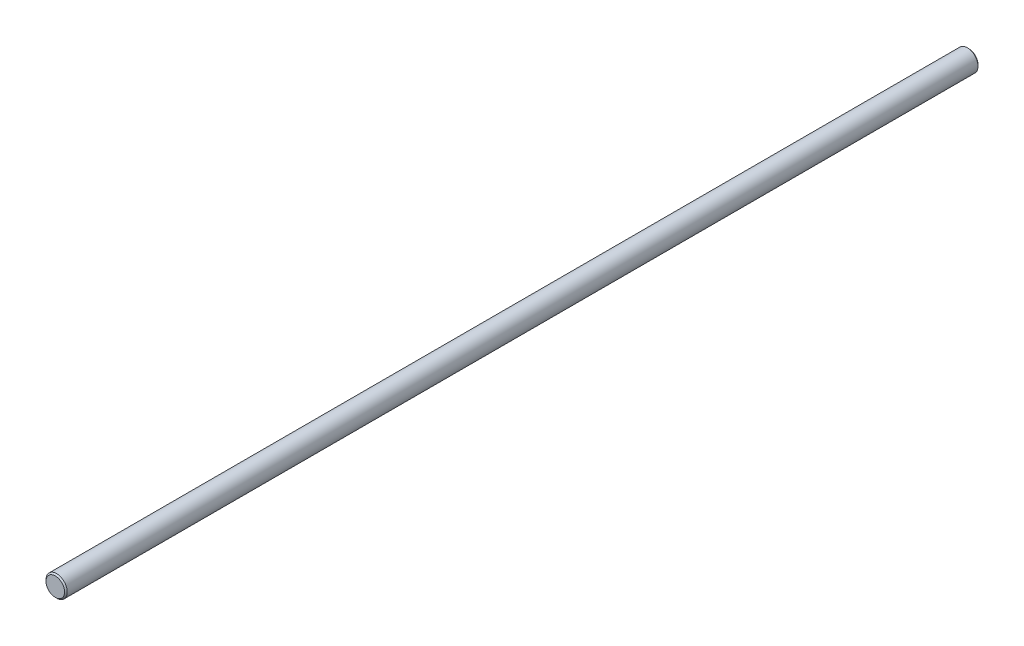
ISO-10303-21;
HEADER;
FILE_DESCRIPTION(('STEP AP214'),'2;1');
FILE_NAME('part.step','',(''),(''),'','','');
FILE_SCHEMA(('AUTOMOTIVE_DESIGN { 1 0 10303 214 1 1 1 1 }'));
ENDSEC;
DATA;
#1=APPLICATION_CONTEXT('core data for automotive mechanical design processes');
#2=APPLICATION_PROTOCOL_DEFINITION('international standard','automotive_design',2000,#1);
#3=PRODUCT_CONTEXT('',#1,'mechanical');
#4=PRODUCT('Part','Part','',(#3));
#5=PRODUCT_RELATED_PRODUCT_CATEGORY('part','',(#4));
#6=PRODUCT_DEFINITION_FORMATION('','',#4);
#7=PRODUCT_DEFINITION_CONTEXT('part definition',#1,'design');
#8=PRODUCT_DEFINITION('design','',#6,#7);
#9=PRODUCT_DEFINITION_SHAPE('','',#8);
#10=(LENGTH_UNIT() NAMED_UNIT(*) SI_UNIT(.MILLI.,.METRE.));
#11=(NAMED_UNIT(*) PLANE_ANGLE_UNIT() SI_UNIT($,.RADIAN.));
#12=(NAMED_UNIT(*) SI_UNIT($,.STERADIAN.) SOLID_ANGLE_UNIT());
#13=UNCERTAINTY_MEASURE_WITH_UNIT(LENGTH_MEASURE(1.E-05),#10,'distance_accuracy_value','');
#14=(GEOMETRIC_REPRESENTATION_CONTEXT(3) GLOBAL_UNCERTAINTY_ASSIGNED_CONTEXT((#13)) GLOBAL_UNIT_ASSIGNED_CONTEXT((#10,
#11,#12)) REPRESENTATION_CONTEXT('',''));
#15=CARTESIAN_POINT('',(0.,0.,0.));
#16=DIRECTION('',(0.,0.,1.));
#17=DIRECTION('',(1.,0.,0.));
#18=AXIS2_PLACEMENT_3D('',#15,#16,#17);
#19=CARTESIAN_POINT('',(0.,0.,-354.913708498986));
#20=DIRECTION('',(0.,0.,1.));
#21=DIRECTION('',(1.,0.,0.));
#22=AXIS2_PLACEMENT_3D('',#19,#20,#21);
#23=CYLINDRICAL_SURFACE('',#22,4.);
#24=CARTESIAN_POINT('',(0.,0.,-0.5));
#25=DIRECTION('',(0.,0.,1.));
#26=DIRECTION('',(1.,0.,0.));
#27=AXIS2_PLACEMENT_3D('',#24,#25,#26);
#28=CIRCLE('',#27,4.);
#29=CARTESIAN_POINT('',(4.,0.,-0.5));
#30=VERTEX_POINT('',#29);
#31=EDGE_CURVE('E38',#30,#30,#28,.F.);
#32=ORIENTED_EDGE('',*,*,#31,.T.);
#33=EDGE_LOOP('',(#32));
#34=FACE_BOUND('',#33,.T.);
#35=CARTESIAN_POINT('',(0.,0.,-343.100000000001));
#36=DIRECTION('',(0.,0.,1.));
#37=DIRECTION('',(1.,0.,0.));
#38=AXIS2_PLACEMENT_3D('',#35,#36,#37);
#39=CIRCLE('',#38,4.);
#40=CARTESIAN_POINT('',(4.,0.,-343.100000000001));
#41=VERTEX_POINT('',#40);
#42=EDGE_CURVE('E42',#41,#41,#39,.T.);
#43=ORIENTED_EDGE('',*,*,#42,.T.);
#44=EDGE_LOOP('',(#43));
#45=FACE_BOUND('',#44,.T.);
#46=ADVANCED_FACE('F31',(#34,#45),#23,.T.);
#47=CARTESIAN_POINT('',(0.,0.,0.));
#48=DIRECTION('',(0.,0.,1.));
#49=DIRECTION('',(1.,0.,0.));
#50=AXIS2_PLACEMENT_3D('',#47,#48,#49);
#51=PLANE('',#50);
#52=CARTESIAN_POINT('',(0.,0.,0.));
#53=DIRECTION('',(0.,0.,1.));
#54=DIRECTION('',(1.,0.,0.));
#55=AXIS2_PLACEMENT_3D('',#52,#53,#54);
#56=CIRCLE('',#55,3.5);
#57=CARTESIAN_POINT('',(3.5,0.,0.));
#58=VERTEX_POINT('',#57);
#59=EDGE_CURVE('E46',#58,#58,#56,.T.);
#60=ORIENTED_EDGE('',*,*,#59,.T.);
#61=EDGE_LOOP('',(#60));
#62=FACE_BOUND('',#61,.T.);
#63=ADVANCED_FACE('F52',(#62),#51,.T.);
#64=CARTESIAN_POINT('',(0.,4.,-343.600000000001));
#65=DIRECTION('',(0.,0.,1.));
#66=DIRECTION('',(0.,1.,0.));
#67=AXIS2_PLACEMENT_3D('',#64,#65,#66);
#68=PLANE('',#67);
#69=CARTESIAN_POINT('',(0.,0.,-343.600000000001));
#70=DIRECTION('',(0.,0.,1.));
#71=DIRECTION('',(0.,-1.,0.));
#72=AXIS2_PLACEMENT_3D('',#69,#70,#71);
#73=CIRCLE('',#72,3.5);
#74=CARTESIAN_POINT('',(0.,-3.5,-343.600000000001));
#75=VERTEX_POINT('',#74);
#76=EDGE_CURVE('E10',#75,#75,#73,.F.);
#77=ORIENTED_EDGE('',*,*,#76,.T.);
#78=EDGE_LOOP('',(#77));
#79=FACE_BOUND('',#78,.T.);
#80=ADVANCED_FACE('F56',(#79),#68,.F.);
#81=CARTESIAN_POINT('',(0.,0.,0.));
#82=DIRECTION('',(0.,0.,-1.));
#83=DIRECTION('',(-1.,0.,0.));
#84=AXIS2_PLACEMENT_3D('',#81,#82,#83);
#85=CONICAL_SURFACE('',#84,3.5,0.785398163397445);
#86=ORIENTED_EDGE('',*,*,#31,.F.);
#87=EDGE_LOOP('',(#86));
#88=FACE_BOUND('',#87,.T.);
#89=ORIENTED_EDGE('',*,*,#59,.F.);
#90=EDGE_LOOP('',(#89));
#91=FACE_BOUND('',#90,.T.);
#92=ADVANCED_FACE('F54',(#88,#91),#85,.T.);
#93=CARTESIAN_POINT('',(0.,0.,-343.600000000001));
#94=DIRECTION('',(0.,0.,1.));
#95=DIRECTION('',(1.,0.,0.));
#96=AXIS2_PLACEMENT_3D('',#93,#94,#95);
#97=CONICAL_SURFACE('',#96,3.5,0.785398163397389);
#98=ORIENTED_EDGE('',*,*,#42,.F.);
#99=EDGE_LOOP('',(#98));
#100=FACE_BOUND('',#99,.T.);
#101=ORIENTED_EDGE('',*,*,#76,.F.);
#102=EDGE_LOOP('',(#101));
#103=FACE_BOUND('',#102,.T.);
#104=ADVANCED_FACE('F33',(#100,#103),#97,.T.);
#105=CLOSED_SHELL('',(#46,#63,#80,#92,#104));
#106=MANIFOLD_SOLID_BREP('B2',#105);
#107=ADVANCED_BREP_SHAPE_REPRESENTATION('',(#18,#106),#14);
#108=SHAPE_DEFINITION_REPRESENTATION(#9,#107);
ENDSEC;
END-ISO-10303-21;
